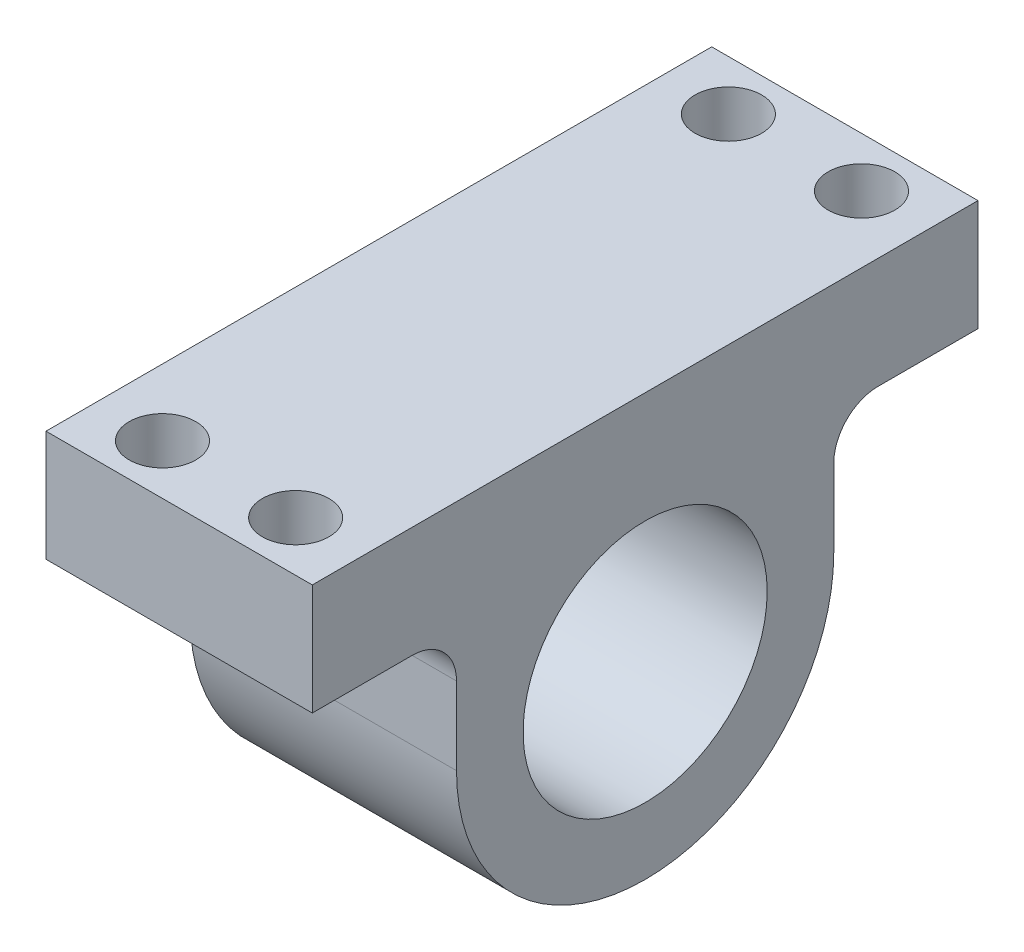
ISO-10303-21;
HEADER;
FILE_DESCRIPTION(('STEP AP214'),'2;1');
FILE_NAME('part.step','',(''),(''),'','','');
FILE_SCHEMA(('AUTOMOTIVE_DESIGN { 1 0 10303 214 1 1 1 1 }'));
ENDSEC;
DATA;
#1=APPLICATION_CONTEXT('core data for automotive mechanical design processes');
#2=APPLICATION_PROTOCOL_DEFINITION('international standard','automotive_design',2000,#1);
#3=PRODUCT_CONTEXT('',#1,'mechanical');
#4=PRODUCT('Part','Part','',(#3));
#5=PRODUCT_RELATED_PRODUCT_CATEGORY('part','',(#4));
#6=PRODUCT_DEFINITION_FORMATION('','',#4);
#7=PRODUCT_DEFINITION_CONTEXT('part definition',#1,'design');
#8=PRODUCT_DEFINITION('design','',#6,#7);
#9=PRODUCT_DEFINITION_SHAPE('','',#8);
#10=(LENGTH_UNIT() NAMED_UNIT(*) SI_UNIT(.MILLI.,.METRE.));
#11=(NAMED_UNIT(*) PLANE_ANGLE_UNIT() SI_UNIT($,.RADIAN.));
#12=(NAMED_UNIT(*) SI_UNIT($,.STERADIAN.) SOLID_ANGLE_UNIT());
#13=UNCERTAINTY_MEASURE_WITH_UNIT(LENGTH_MEASURE(1.E-05),#10,'distance_accuracy_value','');
#14=(GEOMETRIC_REPRESENTATION_CONTEXT(3) GLOBAL_UNCERTAINTY_ASSIGNED_CONTEXT((#13)) GLOBAL_UNIT_ASSIGNED_CONTEXT((#10,
#11,#12)) REPRESENTATION_CONTEXT('',''));
#15=CARTESIAN_POINT('',(0.,0.,0.));
#16=DIRECTION('',(0.,0.,1.));
#17=DIRECTION('',(1.,0.,0.));
#18=AXIS2_PLACEMENT_3D('',#15,#16,#17);
#19=CARTESIAN_POINT('',(12.,10.5,15.));
#20=DIRECTION('',(0.,-1.,0.));
#21=DIRECTION('',(0.,0.,-1.));
#22=AXIS2_PLACEMENT_3D('',#19,#20,#21);
#23=PLANE('',#22);
#24=CARTESIAN_POINT('',(9.,10.5,12.75));
#25=DIRECTION('',(0.,-1.,0.));
#26=DIRECTION('',(0.,0.,-1.));
#27=AXIS2_PLACEMENT_3D('',#24,#25,#26);
#28=CIRCLE('',#27,1.5);
#29=CARTESIAN_POINT('',(9.,10.5,11.25));
#30=VERTEX_POINT('',#29);
#31=EDGE_CURVE('E219',#30,#30,#28,.T.);
#32=ORIENTED_EDGE('',*,*,#31,.T.);
#33=EDGE_LOOP('',(#32));
#34=FACE_BOUND('',#33,.T.);
#35=CARTESIAN_POINT('',(3.,10.5,12.75));
#36=DIRECTION('',(0.,-1.,0.));
#37=DIRECTION('',(0.,0.,-1.));
#38=AXIS2_PLACEMENT_3D('',#35,#36,#37);
#39=CIRCLE('',#38,1.5);
#40=CARTESIAN_POINT('',(3.,10.5,11.25));
#41=VERTEX_POINT('',#40);
#42=EDGE_CURVE('E213',#41,#41,#39,.T.);
#43=ORIENTED_EDGE('',*,*,#42,.T.);
#44=EDGE_LOOP('',(#43));
#45=FACE_BOUND('',#44,.T.);
#46=DIRECTION('',(0.,0.,1.));
#47=VECTOR('',#46,1.);
#48=CARTESIAN_POINT('',(0.,10.5,15.));
#49=LINE('',#48,#47);
#50=CARTESIAN_POINT('',(0.,10.5,-15.));
#51=VERTEX_POINT('',#50);
#52=CARTESIAN_POINT('',(0.,10.5,15.));
#53=VERTEX_POINT('',#52);
#54=EDGE_CURVE('E146',#51,#53,#49,.T.);
#55=ORIENTED_EDGE('',*,*,#54,.T.);
#56=DIRECTION('',(-1.,0.,0.));
#57=VECTOR('',#56,1.);
#58=CARTESIAN_POINT('',(12.,10.5,15.));
#59=LINE('',#58,#57);
#60=CARTESIAN_POINT('',(12.,10.5,15.));
#61=VERTEX_POINT('',#60);
#62=EDGE_CURVE('E42',#61,#53,#59,.T.);
#63=ORIENTED_EDGE('',*,*,#62,.F.);
#64=DIRECTION('',(0.,0.,1.));
#65=VECTOR('',#64,1.);
#66=CARTESIAN_POINT('',(12.,10.5,15.));
#67=LINE('',#66,#65);
#68=CARTESIAN_POINT('',(12.,10.5,-15.));
#69=VERTEX_POINT('',#68);
#70=EDGE_CURVE('E99',#69,#61,#67,.T.);
#71=ORIENTED_EDGE('',*,*,#70,.F.);
#72=DIRECTION('',(-1.,0.,0.));
#73=VECTOR('',#72,1.);
#74=CARTESIAN_POINT('',(12.,10.5,-15.));
#75=LINE('',#74,#73);
#76=EDGE_CURVE('E11',#69,#51,#75,.T.);
#77=ORIENTED_EDGE('',*,*,#76,.T.);
#78=EDGE_LOOP('',(#55,#63,#71,#77));
#79=FACE_BOUND('',#78,.T.);
#80=CARTESIAN_POINT('',(9.,10.5,-12.75));
#81=DIRECTION('',(0.,-1.,0.));
#82=DIRECTION('',(0.,0.,-1.));
#83=AXIS2_PLACEMENT_3D('',#80,#81,#82);
#84=CIRCLE('',#83,1.5);
#85=CARTESIAN_POINT('',(9.,10.5,-14.25));
#86=VERTEX_POINT('',#85);
#87=EDGE_CURVE('E226',#86,#86,#84,.F.);
#88=ORIENTED_EDGE('',*,*,#87,.F.);
#89=EDGE_LOOP('',(#88));
#90=FACE_BOUND('',#89,.T.);
#91=CARTESIAN_POINT('',(3.,10.5,-12.75));
#92=DIRECTION('',(0.,-1.,0.));
#93=DIRECTION('',(0.,0.,-1.));
#94=AXIS2_PLACEMENT_3D('',#91,#92,#93);
#95=CIRCLE('',#94,1.5);
#96=CARTESIAN_POINT('',(3.,10.5,-14.25));
#97=VERTEX_POINT('',#96);
#98=EDGE_CURVE('E225',#97,#97,#95,.F.);
#99=ORIENTED_EDGE('',*,*,#98,.F.);
#100=EDGE_LOOP('',(#99));
#101=FACE_BOUND('',#100,.T.);
#102=ADVANCED_FACE('F33',(#34,#45,#79,#90,#101),#23,.F.);
#103=CARTESIAN_POINT('',(12.,3.5,-10.5));
#104=DIRECTION('',(-1.,0.,0.));
#105=DIRECTION('',(0.,0.,1.));
#106=AXIS2_PLACEMENT_3D('',#103,#104,#105);
#107=PLANE('',#106);
#108=DIRECTION('',(0.,1.,0.));
#109=VECTOR('',#108,1.);
#110=CARTESIAN_POINT('',(12.,10.5,-15.));
#111=LINE('',#110,#109);
#112=CARTESIAN_POINT('',(12.,5.50000000000001,-15.));
#113=VERTEX_POINT('',#112);
#114=EDGE_CURVE('E162',#113,#69,#111,.T.);
#115=ORIENTED_EDGE('',*,*,#114,.T.);
#116=ORIENTED_EDGE('',*,*,#70,.T.);
#117=DIRECTION('',(0.,-1.,0.));
#118=VECTOR('',#117,1.);
#119=CARTESIAN_POINT('',(12.,5.5,15.));
#120=LINE('',#119,#118);
#121=CARTESIAN_POINT('',(12.,5.5,15.));
#122=VERTEX_POINT('',#121);
#123=EDGE_CURVE('E183',#61,#122,#120,.T.);
#124=ORIENTED_EDGE('',*,*,#123,.T.);
#125=DIRECTION('',(0.,0.,-1.));
#126=VECTOR('',#125,1.);
#127=CARTESIAN_POINT('',(12.,5.5,15.));
#128=LINE('',#127,#126);
#129=CARTESIAN_POINT('',(12.,5.5,10.5));
#130=VERTEX_POINT('',#129);
#131=EDGE_CURVE('E202',#122,#130,#128,.T.);
#132=ORIENTED_EDGE('',*,*,#131,.T.);
#133=CARTESIAN_POINT('',(12.,3.5,10.5));
#134=DIRECTION('',(-1.,0.,0.));
#135=DIRECTION('',(0.,0.,1.));
#136=AXIS2_PLACEMENT_3D('',#133,#134,#135);
#137=CIRCLE('',#136,2.);
#138=CARTESIAN_POINT('',(12.,3.49999999999999,8.5));
#139=VERTEX_POINT('',#138);
#140=EDGE_CURVE('E199',#130,#139,#137,.T.);
#141=ORIENTED_EDGE('',*,*,#140,.T.);
#142=DIRECTION('',(0.,-1.,0.));
#143=VECTOR('',#142,1.);
#144=CARTESIAN_POINT('',(12.,0.,8.5));
#145=LINE('',#144,#143);
#146=CARTESIAN_POINT('',(12.,0.,8.5));
#147=VERTEX_POINT('',#146);
#148=EDGE_CURVE('E201',#139,#147,#145,.T.);
#149=ORIENTED_EDGE('',*,*,#148,.T.);
#150=CARTESIAN_POINT('',(12.,0.,0.));
#151=DIRECTION('',(1.,0.,0.));
#152=DIRECTION('',(0.,0.,-1.));
#153=AXIS2_PLACEMENT_3D('',#150,#151,#152);
#154=CIRCLE('',#153,8.5);
#155=CARTESIAN_POINT('',(12.,0.,-8.5));
#156=VERTEX_POINT('',#155);
#157=EDGE_CURVE('E125',#147,#156,#154,.T.);
#158=ORIENTED_EDGE('',*,*,#157,.T.);
#159=DIRECTION('',(0.,1.,0.));
#160=VECTOR('',#159,1.);
#161=CARTESIAN_POINT('',(12.,0.,-8.5));
#162=LINE('',#161,#160);
#163=CARTESIAN_POINT('',(12.,3.49999999999999,-8.5));
#164=VERTEX_POINT('',#163);
#165=EDGE_CURVE('E118',#156,#164,#162,.T.);
#166=ORIENTED_EDGE('',*,*,#165,.T.);
#167=CARTESIAN_POINT('',(12.,3.5,-10.5));
#168=DIRECTION('',(-1.,0.,0.));
#169=DIRECTION('',(0.,0.,1.));
#170=AXIS2_PLACEMENT_3D('',#167,#168,#169);
#171=CIRCLE('',#170,2.);
#172=CARTESIAN_POINT('',(12.,5.50000000000001,-10.5));
#173=VERTEX_POINT('',#172);
#174=EDGE_CURVE('E123',#164,#173,#171,.T.);
#175=ORIENTED_EDGE('',*,*,#174,.T.);
#176=DIRECTION('',(0.,0.,-1.));
#177=VECTOR('',#176,1.);
#178=CARTESIAN_POINT('',(12.,5.5,-10.5));
#179=LINE('',#178,#177);
#180=EDGE_CURVE('E50',#173,#113,#179,.T.);
#181=ORIENTED_EDGE('',*,*,#180,.T.);
#182=EDGE_LOOP('',(#115,#116,#124,#132,#141,#149,#158,#166,#175,#181));
#183=FACE_BOUND('',#182,.T.);
#184=CARTESIAN_POINT('',(12.,0.,0.));
#185=DIRECTION('',(1.,0.,0.));
#186=DIRECTION('',(0.,0.,-1.));
#187=AXIS2_PLACEMENT_3D('',#184,#185,#186);
#188=CIRCLE('',#187,5.5);
#189=CARTESIAN_POINT('',(12.,0.,-5.5));
#190=VERTEX_POINT('',#189);
#191=EDGE_CURVE('E147',#190,#190,#188,.T.);
#192=ORIENTED_EDGE('',*,*,#191,.F.);
#193=EDGE_LOOP('',(#192));
#194=FACE_BOUND('',#193,.T.);
#195=ADVANCED_FACE('F120',(#183,#194),#107,.F.);
#196=CARTESIAN_POINT('',(0.,3.5,-10.5));
#197=DIRECTION('',(-1.,0.,0.));
#198=DIRECTION('',(0.,0.,1.));
#199=AXIS2_PLACEMENT_3D('',#196,#197,#198);
#200=PLANE('',#199);
#201=DIRECTION('',(0.,1.,0.));
#202=VECTOR('',#201,1.);
#203=CARTESIAN_POINT('',(0.,10.5,-15.));
#204=LINE('',#203,#202);
#205=CARTESIAN_POINT('',(0.,5.50000000000001,-15.));
#206=VERTEX_POINT('',#205);
#207=EDGE_CURVE('E143',#206,#51,#204,.T.);
#208=ORIENTED_EDGE('',*,*,#207,.F.);
#209=DIRECTION('',(0.,0.,-1.));
#210=VECTOR('',#209,1.);
#211=CARTESIAN_POINT('',(0.,5.5,-10.5));
#212=LINE('',#211,#210);
#213=CARTESIAN_POINT('',(0.,5.50000000000001,-10.5));
#214=VERTEX_POINT('',#213);
#215=EDGE_CURVE('E91',#214,#206,#212,.T.);
#216=ORIENTED_EDGE('',*,*,#215,.F.);
#217=CARTESIAN_POINT('',(0.,3.5,-10.5));
#218=DIRECTION('',(-1.,0.,0.));
#219=DIRECTION('',(0.,0.,1.));
#220=AXIS2_PLACEMENT_3D('',#217,#218,#219);
#221=CIRCLE('',#220,2.);
#222=CARTESIAN_POINT('',(0.,3.49999999999999,-8.5));
#223=VERTEX_POINT('',#222);
#224=EDGE_CURVE('E85',#223,#214,#221,.T.);
#225=ORIENTED_EDGE('',*,*,#224,.F.);
#226=DIRECTION('',(0.,1.,0.));
#227=VECTOR('',#226,1.);
#228=CARTESIAN_POINT('',(0.,0.,-8.5));
#229=LINE('',#228,#227);
#230=CARTESIAN_POINT('',(0.,0.,-8.5));
#231=VERTEX_POINT('',#230);
#232=EDGE_CURVE('E133',#231,#223,#229,.T.);
#233=ORIENTED_EDGE('',*,*,#232,.F.);
#234=CARTESIAN_POINT('',(0.,0.,0.));
#235=DIRECTION('',(1.,0.,0.));
#236=DIRECTION('',(0.,0.,-1.));
#237=AXIS2_PLACEMENT_3D('',#234,#235,#236);
#238=CIRCLE('',#237,8.5);
#239=CARTESIAN_POINT('',(0.,0.,8.5));
#240=VERTEX_POINT('',#239);
#241=EDGE_CURVE('E157',#240,#231,#238,.T.);
#242=ORIENTED_EDGE('',*,*,#241,.F.);
#243=DIRECTION('',(0.,-1.,0.));
#244=VECTOR('',#243,1.);
#245=CARTESIAN_POINT('',(0.,0.,8.5));
#246=LINE('',#245,#244);
#247=CARTESIAN_POINT('',(0.,3.49999999999999,8.5));
#248=VERTEX_POINT('',#247);
#249=EDGE_CURVE('E155',#248,#240,#246,.T.);
#250=ORIENTED_EDGE('',*,*,#249,.F.);
#251=CARTESIAN_POINT('',(0.,3.5,10.5));
#252=DIRECTION('',(-1.,0.,0.));
#253=DIRECTION('',(0.,0.,1.));
#254=AXIS2_PLACEMENT_3D('',#251,#252,#253);
#255=CIRCLE('',#254,2.);
#256=CARTESIAN_POINT('',(0.,5.5,10.5));
#257=VERTEX_POINT('',#256);
#258=EDGE_CURVE('E153',#257,#248,#255,.T.);
#259=ORIENTED_EDGE('',*,*,#258,.F.);
#260=DIRECTION('',(0.,0.,-1.));
#261=VECTOR('',#260,1.);
#262=CARTESIAN_POINT('',(0.,5.5,15.));
#263=LINE('',#262,#261);
#264=CARTESIAN_POINT('',(0.,5.5,15.));
#265=VERTEX_POINT('',#264);
#266=EDGE_CURVE('E151',#265,#257,#263,.T.);
#267=ORIENTED_EDGE('',*,*,#266,.F.);
#268=DIRECTION('',(0.,-1.,0.));
#269=VECTOR('',#268,1.);
#270=CARTESIAN_POINT('',(0.,5.5,15.));
#271=LINE('',#270,#269);
#272=EDGE_CURVE('E149',#53,#265,#271,.T.);
#273=ORIENTED_EDGE('',*,*,#272,.F.);
#274=ORIENTED_EDGE('',*,*,#54,.F.);
#275=EDGE_LOOP('',(#208,#216,#225,#233,#242,#250,#259,#267,#273,#274));
#276=FACE_BOUND('',#275,.T.);
#277=CARTESIAN_POINT('',(0.,0.,0.));
#278=DIRECTION('',(1.,0.,0.));
#279=DIRECTION('',(0.,0.,-1.));
#280=AXIS2_PLACEMENT_3D('',#277,#278,#279);
#281=CIRCLE('',#280,5.5);
#282=CARTESIAN_POINT('',(0.,0.,-5.5));
#283=VERTEX_POINT('',#282);
#284=EDGE_CURVE('E210',#283,#283,#281,.T.);
#285=ORIENTED_EDGE('',*,*,#284,.T.);
#286=EDGE_LOOP('',(#285));
#287=FACE_BOUND('',#286,.T.);
#288=ADVANCED_FACE('F187',(#276,#287),#200,.T.);
#289=CARTESIAN_POINT('',(12.,10.5,-15.));
#290=DIRECTION('',(0.,0.,1.));
#291=DIRECTION('',(1.,0.,0.));
#292=AXIS2_PLACEMENT_3D('',#289,#290,#291);
#293=PLANE('',#292);
#294=ORIENTED_EDGE('',*,*,#207,.T.);
#295=ORIENTED_EDGE('',*,*,#76,.F.);
#296=ORIENTED_EDGE('',*,*,#114,.F.);
#297=DIRECTION('',(-1.,0.,0.));
#298=VECTOR('',#297,1.);
#299=CARTESIAN_POINT('',(12.,5.50000000000001,-15.));
#300=LINE('',#299,#298);
#301=EDGE_CURVE('E139',#113,#206,#300,.T.);
#302=ORIENTED_EDGE('',*,*,#301,.T.);
#303=EDGE_LOOP('',(#294,#295,#296,#302));
#304=FACE_BOUND('',#303,.T.);
#305=ADVANCED_FACE('F35',(#304),#293,.F.);
#306=CARTESIAN_POINT('',(12.,5.5,15.));
#307=DIRECTION('',(0.,0.,-1.));
#308=DIRECTION('',(-1.,0.,0.));
#309=AXIS2_PLACEMENT_3D('',#306,#307,#308);
#310=PLANE('',#309);
#311=ORIENTED_EDGE('',*,*,#272,.T.);
#312=DIRECTION('',(-1.,0.,0.));
#313=VECTOR('',#312,1.);
#314=CARTESIAN_POINT('',(12.,5.5,15.));
#315=LINE('',#314,#313);
#316=EDGE_CURVE('E175',#122,#265,#315,.T.);
#317=ORIENTED_EDGE('',*,*,#316,.F.);
#318=ORIENTED_EDGE('',*,*,#123,.F.);
#319=ORIENTED_EDGE('',*,*,#62,.T.);
#320=EDGE_LOOP('',(#311,#317,#318,#319));
#321=FACE_BOUND('',#320,.T.);
#322=ADVANCED_FACE('F181',(#321),#310,.F.);
#323=CARTESIAN_POINT('',(12.,5.5,15.));
#324=DIRECTION('',(0.,1.,0.));
#325=DIRECTION('',(0.,0.,1.));
#326=AXIS2_PLACEMENT_3D('',#323,#324,#325);
#327=PLANE('',#326);
#328=CARTESIAN_POINT('',(9.,5.5,12.75));
#329=DIRECTION('',(0.,-1.,0.));
#330=DIRECTION('',(0.,0.,-1.));
#331=AXIS2_PLACEMENT_3D('',#328,#329,#330);
#332=CIRCLE('',#331,1.5);
#333=CARTESIAN_POINT('',(9.,5.5,11.25));
#334=VERTEX_POINT('',#333);
#335=EDGE_CURVE('E229',#334,#334,#332,.T.);
#336=ORIENTED_EDGE('',*,*,#335,.F.);
#337=EDGE_LOOP('',(#336));
#338=FACE_BOUND('',#337,.T.);
#339=CARTESIAN_POINT('',(3.,5.5,12.75));
#340=DIRECTION('',(0.,-1.,0.));
#341=DIRECTION('',(0.,0.,-1.));
#342=AXIS2_PLACEMENT_3D('',#339,#340,#341);
#343=CIRCLE('',#342,1.5);
#344=CARTESIAN_POINT('',(3.,5.5,11.25));
#345=VERTEX_POINT('',#344);
#346=EDGE_CURVE('E216',#345,#345,#343,.T.);
#347=ORIENTED_EDGE('',*,*,#346,.F.);
#348=EDGE_LOOP('',(#347));
#349=FACE_BOUND('',#348,.T.);
#350=ORIENTED_EDGE('',*,*,#266,.T.);
#351=DIRECTION('',(-1.,0.,0.));
#352=VECTOR('',#351,1.);
#353=CARTESIAN_POINT('',(12.,5.5,10.5));
#354=LINE('',#353,#352);
#355=EDGE_CURVE('E172',#130,#257,#354,.T.);
#356=ORIENTED_EDGE('',*,*,#355,.F.);
#357=ORIENTED_EDGE('',*,*,#131,.F.);
#358=ORIENTED_EDGE('',*,*,#316,.T.);
#359=EDGE_LOOP('',(#350,#356,#357,#358));
#360=FACE_BOUND('',#359,.T.);
#361=ADVANCED_FACE('F193',(#338,#349,#360),#327,.F.);
#362=CARTESIAN_POINT('',(12.,3.5,10.5));
#363=DIRECTION('',(-1.,0.,0.));
#364=DIRECTION('',(0.,0.,1.));
#365=AXIS2_PLACEMENT_3D('',#362,#363,#364);
#366=CYLINDRICAL_SURFACE('',#365,2.);
#367=ORIENTED_EDGE('',*,*,#258,.T.);
#368=DIRECTION('',(-1.,0.,0.));
#369=VECTOR('',#368,1.);
#370=CARTESIAN_POINT('',(12.,3.49999999999999,8.5));
#371=LINE('',#370,#369);
#372=EDGE_CURVE('E169',#139,#248,#371,.T.);
#373=ORIENTED_EDGE('',*,*,#372,.F.);
#374=ORIENTED_EDGE('',*,*,#140,.F.);
#375=ORIENTED_EDGE('',*,*,#355,.T.);
#376=EDGE_LOOP('',(#367,#373,#374,#375));
#377=FACE_BOUND('',#376,.T.);
#378=ADVANCED_FACE('F197',(#377),#366,.F.);
#379=CARTESIAN_POINT('',(12.,0.,8.5));
#380=DIRECTION('',(0.,0.,-1.));
#381=DIRECTION('',(-1.,0.,0.));
#382=AXIS2_PLACEMENT_3D('',#379,#380,#381);
#383=PLANE('',#382);
#384=ORIENTED_EDGE('',*,*,#249,.T.);
#385=DIRECTION('',(-1.,0.,0.));
#386=VECTOR('',#385,1.);
#387=CARTESIAN_POINT('',(12.,0.,8.5));
#388=LINE('',#387,#386);
#389=EDGE_CURVE('E166',#147,#240,#388,.T.);
#390=ORIENTED_EDGE('',*,*,#389,.F.);
#391=ORIENTED_EDGE('',*,*,#148,.F.);
#392=ORIENTED_EDGE('',*,*,#372,.T.);
#393=EDGE_LOOP('',(#384,#390,#391,#392));
#394=FACE_BOUND('',#393,.T.);
#395=ADVANCED_FACE('F287',(#394),#383,.F.);
#396=CARTESIAN_POINT('',(12.,0.,0.));
#397=DIRECTION('',(-1.,0.,0.));
#398=DIRECTION('',(0.,0.,1.));
#399=AXIS2_PLACEMENT_3D('',#396,#397,#398);
#400=CYLINDRICAL_SURFACE('',#399,8.5);
#401=ORIENTED_EDGE('',*,*,#241,.T.);
#402=DIRECTION('',(-1.,0.,0.));
#403=VECTOR('',#402,1.);
#404=CARTESIAN_POINT('',(12.,0.,-8.5));
#405=LINE('',#404,#403);
#406=EDGE_CURVE('E134',#156,#231,#405,.T.);
#407=ORIENTED_EDGE('',*,*,#406,.F.);
#408=ORIENTED_EDGE('',*,*,#157,.F.);
#409=ORIENTED_EDGE('',*,*,#389,.T.);
#410=EDGE_LOOP('',(#401,#407,#408,#409));
#411=FACE_BOUND('',#410,.T.);
#412=ADVANCED_FACE('F284',(#411),#400,.T.);
#413=CARTESIAN_POINT('',(12.,0.,-8.5));
#414=DIRECTION('',(0.,0.,1.));
#415=DIRECTION('',(1.,0.,0.));
#416=AXIS2_PLACEMENT_3D('',#413,#414,#415);
#417=PLANE('',#416);
#418=ORIENTED_EDGE('',*,*,#232,.T.);
#419=DIRECTION('',(-1.,0.,0.));
#420=VECTOR('',#419,1.);
#421=CARTESIAN_POINT('',(12.,3.49999999999999,-8.5));
#422=LINE('',#421,#420);
#423=EDGE_CURVE('E130',#164,#223,#422,.T.);
#424=ORIENTED_EDGE('',*,*,#423,.F.);
#425=ORIENTED_EDGE('',*,*,#165,.F.);
#426=ORIENTED_EDGE('',*,*,#406,.T.);
#427=EDGE_LOOP('',(#418,#424,#425,#426));
#428=FACE_BOUND('',#427,.T.);
#429=ADVANCED_FACE('F131',(#428),#417,.F.);
#430=CARTESIAN_POINT('',(12.,3.5,-10.5));
#431=DIRECTION('',(-1.,0.,0.));
#432=DIRECTION('',(0.,0.,1.));
#433=AXIS2_PLACEMENT_3D('',#430,#431,#432);
#434=CYLINDRICAL_SURFACE('',#433,2.);
#435=ORIENTED_EDGE('',*,*,#224,.T.);
#436=DIRECTION('',(-1.,0.,0.));
#437=VECTOR('',#436,1.);
#438=CARTESIAN_POINT('',(12.,5.50000000000001,-10.5));
#439=LINE('',#438,#437);
#440=EDGE_CURVE('E135',#173,#214,#439,.T.);
#441=ORIENTED_EDGE('',*,*,#440,.F.);
#442=ORIENTED_EDGE('',*,*,#174,.F.);
#443=ORIENTED_EDGE('',*,*,#423,.T.);
#444=EDGE_LOOP('',(#435,#441,#442,#443));
#445=FACE_BOUND('',#444,.T.);
#446=ADVANCED_FACE('F137',(#445),#434,.F.);
#447=CARTESIAN_POINT('',(12.,5.5,-10.5));
#448=DIRECTION('',(0.,1.,0.));
#449=DIRECTION('',(0.,0.,1.));
#450=AXIS2_PLACEMENT_3D('',#447,#448,#449);
#451=PLANE('',#450);
#452=CARTESIAN_POINT('',(3.,5.50000000000001,-12.75));
#453=DIRECTION('',(0.,-1.,0.));
#454=DIRECTION('',(0.,0.,-1.));
#455=AXIS2_PLACEMENT_3D('',#452,#453,#454);
#456=CIRCLE('',#455,1.5);
#457=CARTESIAN_POINT('',(3.,5.50000000000001,-14.25));
#458=VERTEX_POINT('',#457);
#459=EDGE_CURVE('E222',#458,#458,#456,.F.);
#460=ORIENTED_EDGE('',*,*,#459,.T.);
#461=EDGE_LOOP('',(#460));
#462=FACE_BOUND('',#461,.T.);
#463=CARTESIAN_POINT('',(9.,5.50000000000001,-12.75));
#464=DIRECTION('',(0.,-1.,0.));
#465=DIRECTION('',(0.,0.,-1.));
#466=AXIS2_PLACEMENT_3D('',#463,#464,#465);
#467=CIRCLE('',#466,1.5);
#468=CARTESIAN_POINT('',(9.,5.50000000000001,-14.25));
#469=VERTEX_POINT('',#468);
#470=EDGE_CURVE('E234',#469,#469,#467,.F.);
#471=ORIENTED_EDGE('',*,*,#470,.T.);
#472=EDGE_LOOP('',(#471));
#473=FACE_BOUND('',#472,.T.);
#474=ORIENTED_EDGE('',*,*,#215,.T.);
#475=ORIENTED_EDGE('',*,*,#301,.F.);
#476=ORIENTED_EDGE('',*,*,#180,.F.);
#477=ORIENTED_EDGE('',*,*,#440,.T.);
#478=EDGE_LOOP('',(#474,#475,#476,#477));
#479=FACE_BOUND('',#478,.T.);
#480=ADVANCED_FACE('F255',(#462,#473,#479),#451,.F.);
#481=CARTESIAN_POINT('',(12.,0.,0.));
#482=DIRECTION('',(-1.,0.,0.));
#483=DIRECTION('',(0.,0.,1.));
#484=AXIS2_PLACEMENT_3D('',#481,#482,#483);
#485=CYLINDRICAL_SURFACE('',#484,5.5);
#486=ORIENTED_EDGE('',*,*,#191,.T.);
#487=EDGE_LOOP('',(#486));
#488=FACE_BOUND('',#487,.T.);
#489=ORIENTED_EDGE('',*,*,#284,.F.);
#490=EDGE_LOOP('',(#489));
#491=FACE_BOUND('',#490,.T.);
#492=ADVANCED_FACE('F258',(#488,#491),#485,.F.);
#493=CARTESIAN_POINT('',(9.,10.5,-12.75));
#494=DIRECTION('',(0.,-1.,0.));
#495=DIRECTION('',(0.,0.,-1.));
#496=AXIS2_PLACEMENT_3D('',#493,#494,#495);
#497=CYLINDRICAL_SURFACE('',#496,1.5);
#498=ORIENTED_EDGE('',*,*,#87,.T.);
#499=EDGE_LOOP('',(#498));
#500=FACE_BOUND('',#499,.T.);
#501=ORIENTED_EDGE('',*,*,#470,.F.);
#502=EDGE_LOOP('',(#501));
#503=FACE_BOUND('',#502,.T.);
#504=ADVANCED_FACE('F240',(#500,#503),#497,.F.);
#505=CARTESIAN_POINT('',(3.,10.5,-12.75));
#506=DIRECTION('',(0.,-1.,0.));
#507=DIRECTION('',(0.,0.,-1.));
#508=AXIS2_PLACEMENT_3D('',#505,#506,#507);
#509=CYLINDRICAL_SURFACE('',#508,1.5);
#510=ORIENTED_EDGE('',*,*,#98,.T.);
#511=EDGE_LOOP('',(#510));
#512=FACE_BOUND('',#511,.T.);
#513=ORIENTED_EDGE('',*,*,#459,.F.);
#514=EDGE_LOOP('',(#513));
#515=FACE_BOUND('',#514,.T.);
#516=ADVANCED_FACE('F248',(#512,#515),#509,.F.);
#517=CARTESIAN_POINT('',(3.,10.5,12.75));
#518=DIRECTION('',(0.,-1.,0.));
#519=DIRECTION('',(0.,0.,-1.));
#520=AXIS2_PLACEMENT_3D('',#517,#518,#519);
#521=CYLINDRICAL_SURFACE('',#520,1.5);
#522=ORIENTED_EDGE('',*,*,#42,.F.);
#523=EDGE_LOOP('',(#522));
#524=FACE_BOUND('',#523,.T.);
#525=ORIENTED_EDGE('',*,*,#346,.T.);
#526=EDGE_LOOP('',(#525));
#527=FACE_BOUND('',#526,.T.);
#528=ADVANCED_FACE('F251',(#524,#527),#521,.F.);
#529=CARTESIAN_POINT('',(9.,10.5,12.75));
#530=DIRECTION('',(0.,-1.,0.));
#531=DIRECTION('',(0.,0.,-1.));
#532=AXIS2_PLACEMENT_3D('',#529,#530,#531);
#533=CYLINDRICAL_SURFACE('',#532,1.5);
#534=ORIENTED_EDGE('',*,*,#31,.F.);
#535=EDGE_LOOP('',(#534));
#536=FACE_BOUND('',#535,.T.);
#537=ORIENTED_EDGE('',*,*,#335,.T.);
#538=EDGE_LOOP('',(#537));
#539=FACE_BOUND('',#538,.T.);
#540=ADVANCED_FACE('F269',(#536,#539),#533,.F.);
#541=CLOSED_SHELL('',(#102,#195,#288,#305,#322,#361,#378,#395,#412,#429,#446,#480,#492,#504,
#516,#528,#540));
#542=MANIFOLD_SOLID_BREP('B2',#541);
#543=ADVANCED_BREP_SHAPE_REPRESENTATION('',(#18,#542),#14);
#544=SHAPE_DEFINITION_REPRESENTATION(#9,#543);
ENDSEC;
END-ISO-10303-21;
